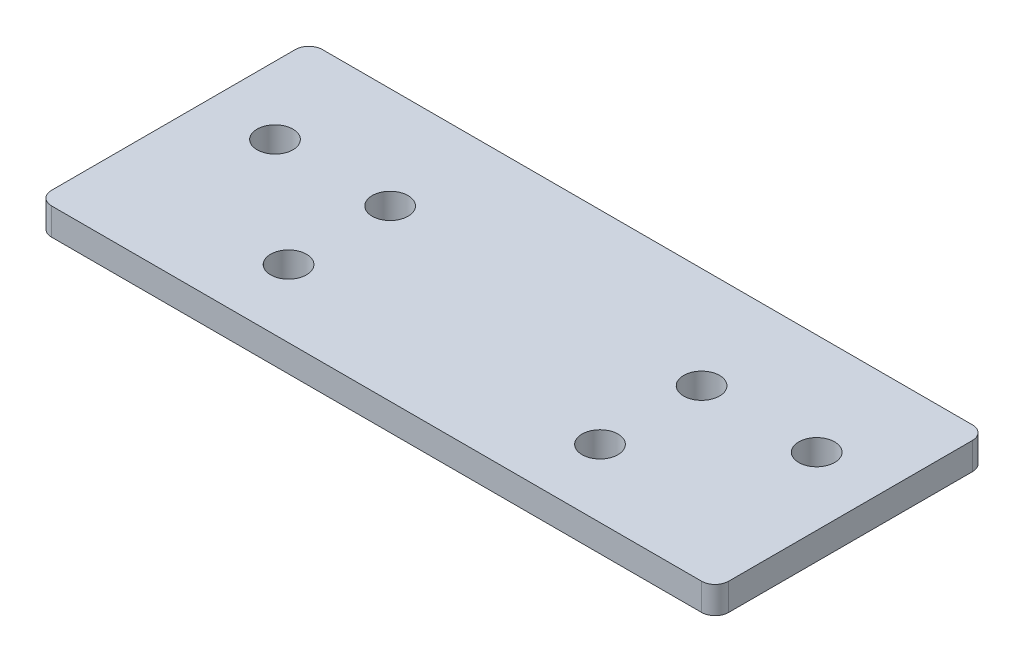
ISO-10303-21;
HEADER;
FILE_DESCRIPTION(('STEP AP214'),'2;1');
FILE_NAME('part.step','',(''),(''),'','','');
FILE_SCHEMA(('AUTOMOTIVE_DESIGN { 1 0 10303 214 1 1 1 1 }'));
ENDSEC;
DATA;
#1=APPLICATION_CONTEXT('core data for automotive mechanical design processes');
#2=APPLICATION_PROTOCOL_DEFINITION('international standard','automotive_design',2000,#1);
#3=PRODUCT_CONTEXT('',#1,'mechanical');
#4=PRODUCT('Part','Part','',(#3));
#5=PRODUCT_RELATED_PRODUCT_CATEGORY('part','',(#4));
#6=PRODUCT_DEFINITION_FORMATION('','',#4);
#7=PRODUCT_DEFINITION_CONTEXT('part definition',#1,'design');
#8=PRODUCT_DEFINITION('design','',#6,#7);
#9=PRODUCT_DEFINITION_SHAPE('','',#8);
#10=(LENGTH_UNIT() NAMED_UNIT(*) SI_UNIT(.MILLI.,.METRE.));
#11=(NAMED_UNIT(*) PLANE_ANGLE_UNIT() SI_UNIT($,.RADIAN.));
#12=(NAMED_UNIT(*) SI_UNIT($,.STERADIAN.) SOLID_ANGLE_UNIT());
#13=UNCERTAINTY_MEASURE_WITH_UNIT(LENGTH_MEASURE(1.E-05),#10,'distance_accuracy_value','');
#14=(GEOMETRIC_REPRESENTATION_CONTEXT(3) GLOBAL_UNCERTAINTY_ASSIGNED_CONTEXT((#13)) GLOBAL_UNIT_ASSIGNED_CONTEXT((#10,
#11,#12)) REPRESENTATION_CONTEXT('',''));
#15=CARTESIAN_POINT('',(0.,0.,0.));
#16=DIRECTION('',(0.,0.,1.));
#17=DIRECTION('',(1.,0.,0.));
#18=AXIS2_PLACEMENT_3D('',#15,#16,#17);
#19=CARTESIAN_POINT('',(-50.,4.,20.));
#20=DIRECTION('',(1.,0.,0.));
#21=DIRECTION('',(0.,0.,-1.));
#22=AXIS2_PLACEMENT_3D('',#19,#20,#21);
#23=PLANE('',#22);
#24=DIRECTION('',(0.,0.,1.));
#25=VECTOR('',#24,1.);
#26=CARTESIAN_POINT('',(-50.,4.,20.));
#27=LINE('',#26,#25);
#28=CARTESIAN_POINT('',(-50.,4.,-18.));
#29=VERTEX_POINT('',#28);
#30=CARTESIAN_POINT('',(-50.,4.,18.));
#31=VERTEX_POINT('',#30);
#32=EDGE_CURVE('E128',#29,#31,#27,.T.);
#33=ORIENTED_EDGE('',*,*,#32,.F.);
#34=DIRECTION('',(0.,-1.,0.));
#35=VECTOR('',#34,1.);
#36=CARTESIAN_POINT('',(-50.,4.,-18.));
#37=LINE('',#36,#35);
#38=CARTESIAN_POINT('',(-50.,0.,-18.));
#39=VERTEX_POINT('',#38);
#40=EDGE_CURVE('E11',#29,#39,#37,.T.);
#41=ORIENTED_EDGE('',*,*,#40,.T.);
#42=DIRECTION('',(0.,0.,1.));
#43=VECTOR('',#42,1.);
#44=CARTESIAN_POINT('',(-50.,0.,20.));
#45=LINE('',#44,#43);
#46=CARTESIAN_POINT('',(-50.,0.,18.));
#47=VERTEX_POINT('',#46);
#48=EDGE_CURVE('E130',#39,#47,#45,.T.);
#49=ORIENTED_EDGE('',*,*,#48,.T.);
#50=DIRECTION('',(0.,-1.,0.));
#51=VECTOR('',#50,1.);
#52=CARTESIAN_POINT('',(-50.,4.,18.));
#53=LINE('',#52,#51);
#54=EDGE_CURVE('E41',#47,#31,#53,.F.);
#55=ORIENTED_EDGE('',*,*,#54,.T.);
#56=EDGE_LOOP('',(#33,#41,#49,#55));
#57=FACE_BOUND('',#56,.T.);
#58=ADVANCED_FACE('F33',(#57),#23,.F.);
#59=CARTESIAN_POINT('',(50.,4.,20.));
#60=DIRECTION('',(0.,0.,-1.));
#61=DIRECTION('',(-1.,0.,0.));
#62=AXIS2_PLACEMENT_3D('',#59,#60,#61);
#63=PLANE('',#62);
#64=DIRECTION('',(1.,0.,0.));
#65=VECTOR('',#64,1.);
#66=CARTESIAN_POINT('',(50.,0.,20.));
#67=LINE('',#66,#65);
#68=CARTESIAN_POINT('',(-48.,0.,20.));
#69=VERTEX_POINT('',#68);
#70=CARTESIAN_POINT('',(48.,0.,20.));
#71=VERTEX_POINT('',#70);
#72=EDGE_CURVE('E126',#69,#71,#67,.T.);
#73=ORIENTED_EDGE('',*,*,#72,.T.);
#74=DIRECTION('',(0.,-1.,0.));
#75=VECTOR('',#74,1.);
#76=CARTESIAN_POINT('',(48.,4.,20.));
#77=LINE('',#76,#75);
#78=CARTESIAN_POINT('',(48.,4.,20.));
#79=VERTEX_POINT('',#78);
#80=EDGE_CURVE('E105',#71,#79,#77,.F.);
#81=ORIENTED_EDGE('',*,*,#80,.T.);
#82=DIRECTION('',(1.,0.,0.));
#83=VECTOR('',#82,1.);
#84=CARTESIAN_POINT('',(50.,4.,20.));
#85=LINE('',#84,#83);
#86=CARTESIAN_POINT('',(-48.,4.,20.));
#87=VERTEX_POINT('',#86);
#88=EDGE_CURVE('E166',#87,#79,#85,.T.);
#89=ORIENTED_EDGE('',*,*,#88,.F.);
#90=DIRECTION('',(0.,-1.,0.));
#91=VECTOR('',#90,1.);
#92=CARTESIAN_POINT('',(-48.,4.,20.));
#93=LINE('',#92,#91);
#94=EDGE_CURVE('E110',#87,#69,#93,.T.);
#95=ORIENTED_EDGE('',*,*,#94,.T.);
#96=EDGE_LOOP('',(#73,#81,#89,#95));
#97=FACE_BOUND('',#96,.T.);
#98=ADVANCED_FACE('F170',(#97),#63,.F.);
#99=CARTESIAN_POINT('',(50.,4.,20.));
#100=DIRECTION('',(-1.,0.,0.));
#101=DIRECTION('',(0.,0.,1.));
#102=AXIS2_PLACEMENT_3D('',#99,#100,#101);
#103=PLANE('',#102);
#104=DIRECTION('',(0.,0.,-1.));
#105=VECTOR('',#104,1.);
#106=CARTESIAN_POINT('',(50.,4.,20.));
#107=LINE('',#106,#105);
#108=CARTESIAN_POINT('',(50.,4.,18.));
#109=VERTEX_POINT('',#108);
#110=CARTESIAN_POINT('',(50.,4.,-18.));
#111=VERTEX_POINT('',#110);
#112=EDGE_CURVE('E119',#109,#111,#107,.T.);
#113=ORIENTED_EDGE('',*,*,#112,.F.);
#114=DIRECTION('',(0.,-1.,0.));
#115=VECTOR('',#114,1.);
#116=CARTESIAN_POINT('',(50.,4.,18.));
#117=LINE('',#116,#115);
#118=CARTESIAN_POINT('',(50.,0.,18.));
#119=VERTEX_POINT('',#118);
#120=EDGE_CURVE('E104',#109,#119,#117,.T.);
#121=ORIENTED_EDGE('',*,*,#120,.T.);
#122=DIRECTION('',(0.,0.,-1.));
#123=VECTOR('',#122,1.);
#124=CARTESIAN_POINT('',(50.,0.,20.));
#125=LINE('',#124,#123);
#126=CARTESIAN_POINT('',(50.,0.,-18.));
#127=VERTEX_POINT('',#126);
#128=EDGE_CURVE('E117',#119,#127,#125,.T.);
#129=ORIENTED_EDGE('',*,*,#128,.T.);
#130=DIRECTION('',(0.,-1.,0.));
#131=VECTOR('',#130,1.);
#132=CARTESIAN_POINT('',(50.,4.,-18.));
#133=LINE('',#132,#131);
#134=EDGE_CURVE('E121',#127,#111,#133,.F.);
#135=ORIENTED_EDGE('',*,*,#134,.T.);
#136=EDGE_LOOP('',(#113,#121,#129,#135));
#137=FACE_BOUND('',#136,.T.);
#138=ADVANCED_FACE('F116',(#137),#103,.F.);
#139=CARTESIAN_POINT('',(50.,4.,-20.));
#140=DIRECTION('',(0.,0.,1.));
#141=DIRECTION('',(1.,0.,0.));
#142=AXIS2_PLACEMENT_3D('',#139,#140,#141);
#143=PLANE('',#142);
#144=DIRECTION('',(-1.,0.,0.));
#145=VECTOR('',#144,1.);
#146=CARTESIAN_POINT('',(50.,4.,-20.));
#147=LINE('',#146,#145);
#148=CARTESIAN_POINT('',(48.,4.,-20.));
#149=VERTEX_POINT('',#148);
#150=CARTESIAN_POINT('',(-48.,4.,-20.));
#151=VERTEX_POINT('',#150);
#152=EDGE_CURVE('E134',#149,#151,#147,.T.);
#153=ORIENTED_EDGE('',*,*,#152,.F.);
#154=DIRECTION('',(0.,-1.,0.));
#155=VECTOR('',#154,1.);
#156=CARTESIAN_POINT('',(48.,4.,-20.));
#157=LINE('',#156,#155);
#158=CARTESIAN_POINT('',(48.,0.,-20.));
#159=VERTEX_POINT('',#158);
#160=EDGE_CURVE('E151',#149,#159,#157,.T.);
#161=ORIENTED_EDGE('',*,*,#160,.T.);
#162=DIRECTION('',(-1.,0.,0.));
#163=VECTOR('',#162,1.);
#164=CARTESIAN_POINT('',(50.,0.,-20.));
#165=LINE('',#164,#163);
#166=CARTESIAN_POINT('',(-48.,0.,-20.));
#167=VERTEX_POINT('',#166);
#168=EDGE_CURVE('E125',#159,#167,#165,.T.);
#169=ORIENTED_EDGE('',*,*,#168,.T.);
#170=DIRECTION('',(0.,-1.,0.));
#171=VECTOR('',#170,1.);
#172=CARTESIAN_POINT('',(-48.,4.,-20.));
#173=LINE('',#172,#171);
#174=EDGE_CURVE('E48',#167,#151,#173,.F.);
#175=ORIENTED_EDGE('',*,*,#174,.T.);
#176=EDGE_LOOP('',(#153,#161,#169,#175));
#177=FACE_BOUND('',#176,.T.);
#178=ADVANCED_FACE('F217',(#177),#143,.F.);
#179=CARTESIAN_POINT('',(0.,4.,0.));
#180=DIRECTION('',(0.,1.,0.));
#181=DIRECTION('',(0.,0.,1.));
#182=AXIS2_PLACEMENT_3D('',#179,#180,#181);
#183=PLANE('',#182);
#184=CARTESIAN_POINT('',(-40.,4.,-5.));
#185=DIRECTION('',(0.,1.,0.));
#186=DIRECTION('',(0.,0.,1.));
#187=AXIS2_PLACEMENT_3D('',#184,#185,#186);
#188=CIRCLE('',#187,2.64999999999999);
#189=CARTESIAN_POINT('',(-40.,4.,-2.35000000000001));
#190=VERTEX_POINT('',#189);
#191=EDGE_CURVE('E208',#190,#190,#188,.T.);
#192=ORIENTED_EDGE('',*,*,#191,.F.);
#193=EDGE_LOOP('',(#192));
#194=FACE_BOUND('',#193,.T.);
#195=CARTESIAN_POINT('',(-23.,4.,-5.));
#196=DIRECTION('',(0.,1.,0.));
#197=DIRECTION('',(0.,0.,1.));
#198=AXIS2_PLACEMENT_3D('',#195,#196,#197);
#199=CIRCLE('',#198,2.64999999999999);
#200=CARTESIAN_POINT('',(-23.,4.,-2.35000000000001));
#201=VERTEX_POINT('',#200);
#202=EDGE_CURVE('E202',#201,#201,#199,.T.);
#203=ORIENTED_EDGE('',*,*,#202,.F.);
#204=EDGE_LOOP('',(#203));
#205=FACE_BOUND('',#204,.T.);
#206=CARTESIAN_POINT('',(-23.,4.,10.));
#207=DIRECTION('',(0.,1.,0.));
#208=DIRECTION('',(0.,0.,1.));
#209=AXIS2_PLACEMENT_3D('',#206,#207,#208);
#210=CIRCLE('',#209,2.64999999999999);
#211=CARTESIAN_POINT('',(-23.,4.,12.65));
#212=VERTEX_POINT('',#211);
#213=EDGE_CURVE('E196',#212,#212,#210,.T.);
#214=ORIENTED_EDGE('',*,*,#213,.F.);
#215=EDGE_LOOP('',(#214));
#216=FACE_BOUND('',#215,.T.);
#217=CARTESIAN_POINT('',(23.,4.,9.99999999999999));
#218=DIRECTION('',(0.,1.,0.));
#219=DIRECTION('',(0.,0.,1.));
#220=AXIS2_PLACEMENT_3D('',#217,#218,#219);
#221=CIRCLE('',#220,2.64999999999999);
#222=CARTESIAN_POINT('',(23.,4.,12.65));
#223=VERTEX_POINT('',#222);
#224=EDGE_CURVE('E190',#223,#223,#221,.T.);
#225=ORIENTED_EDGE('',*,*,#224,.F.);
#226=EDGE_LOOP('',(#225));
#227=FACE_BOUND('',#226,.T.);
#228=CARTESIAN_POINT('',(23.,4.,-5.00000000000001));
#229=DIRECTION('',(0.,1.,0.));
#230=DIRECTION('',(0.,0.,1.));
#231=AXIS2_PLACEMENT_3D('',#228,#229,#230);
#232=CIRCLE('',#231,2.64999999999999);
#233=CARTESIAN_POINT('',(23.,4.,-2.35000000000002));
#234=VERTEX_POINT('',#233);
#235=EDGE_CURVE('E184',#234,#234,#232,.T.);
#236=ORIENTED_EDGE('',*,*,#235,.F.);
#237=EDGE_LOOP('',(#236));
#238=FACE_BOUND('',#237,.T.);
#239=CARTESIAN_POINT('',(40.,4.,-5.00000000000001));
#240=DIRECTION('',(0.,1.,0.));
#241=DIRECTION('',(0.,0.,1.));
#242=AXIS2_PLACEMENT_3D('',#239,#240,#241);
#243=CIRCLE('',#242,2.64999999999999);
#244=CARTESIAN_POINT('',(40.,4.,-2.35000000000002));
#245=VERTEX_POINT('',#244);
#246=EDGE_CURVE('E173',#245,#245,#243,.T.);
#247=ORIENTED_EDGE('',*,*,#246,.F.);
#248=EDGE_LOOP('',(#247));
#249=FACE_BOUND('',#248,.T.);
#250=ORIENTED_EDGE('',*,*,#88,.T.);
#251=CARTESIAN_POINT('',(48.,4.,18.));
#252=DIRECTION('',(0.,1.,0.));
#253=DIRECTION('',(0.,0.,1.));
#254=AXIS2_PLACEMENT_3D('',#251,#252,#253);
#255=CIRCLE('',#254,2.);
#256=EDGE_CURVE('E148',#79,#109,#255,.T.);
#257=ORIENTED_EDGE('',*,*,#256,.T.);
#258=ORIENTED_EDGE('',*,*,#112,.T.);
#259=CARTESIAN_POINT('',(48.,4.,-18.));
#260=DIRECTION('',(0.,1.,0.));
#261=DIRECTION('',(0.,0.,1.));
#262=AXIS2_PLACEMENT_3D('',#259,#260,#261);
#263=CIRCLE('',#262,2.);
#264=EDGE_CURVE('E55',#111,#149,#263,.T.);
#265=ORIENTED_EDGE('',*,*,#264,.T.);
#266=ORIENTED_EDGE('',*,*,#152,.T.);
#267=CARTESIAN_POINT('',(-48.,4.,-18.));
#268=DIRECTION('',(0.,1.,0.));
#269=DIRECTION('',(0.,0.,1.));
#270=AXIS2_PLACEMENT_3D('',#267,#268,#269);
#271=CIRCLE('',#270,2.);
#272=EDGE_CURVE('E145',#151,#29,#271,.T.);
#273=ORIENTED_EDGE('',*,*,#272,.T.);
#274=ORIENTED_EDGE('',*,*,#32,.T.);
#275=CARTESIAN_POINT('',(-48.,4.,18.));
#276=DIRECTION('',(0.,1.,0.));
#277=DIRECTION('',(0.,0.,1.));
#278=AXIS2_PLACEMENT_3D('',#275,#276,#277);
#279=CIRCLE('',#278,2.);
#280=EDGE_CURVE('E143',#31,#87,#279,.T.);
#281=ORIENTED_EDGE('',*,*,#280,.T.);
#282=EDGE_LOOP('',(#250,#257,#258,#265,#266,#273,#274,#281));
#283=FACE_BOUND('',#282,.T.);
#284=ADVANCED_FACE('F163',(#194,#205,#216,#227,#238,#249,#283),#183,.T.);
#285=CARTESIAN_POINT('',(0.,0.,0.));
#286=DIRECTION('',(0.,1.,0.));
#287=DIRECTION('',(0.,0.,1.));
#288=AXIS2_PLACEMENT_3D('',#285,#286,#287);
#289=PLANE('',#288);
#290=CARTESIAN_POINT('',(-40.,0.,-5.));
#291=DIRECTION('',(0.,1.,0.));
#292=DIRECTION('',(0.,0.,1.));
#293=AXIS2_PLACEMENT_3D('',#290,#291,#292);
#294=CIRCLE('',#293,2.64999999999999);
#295=CARTESIAN_POINT('',(-40.,0.,-2.35000000000001));
#296=VERTEX_POINT('',#295);
#297=EDGE_CURVE('E205',#296,#296,#294,.T.);
#298=ORIENTED_EDGE('',*,*,#297,.T.);
#299=EDGE_LOOP('',(#298));
#300=FACE_BOUND('',#299,.T.);
#301=CARTESIAN_POINT('',(-23.,0.,-5.));
#302=DIRECTION('',(0.,1.,0.));
#303=DIRECTION('',(0.,0.,1.));
#304=AXIS2_PLACEMENT_3D('',#301,#302,#303);
#305=CIRCLE('',#304,2.64999999999999);
#306=CARTESIAN_POINT('',(-23.,0.,-2.35000000000001));
#307=VERTEX_POINT('',#306);
#308=EDGE_CURVE('E199',#307,#307,#305,.T.);
#309=ORIENTED_EDGE('',*,*,#308,.T.);
#310=EDGE_LOOP('',(#309));
#311=FACE_BOUND('',#310,.T.);
#312=CARTESIAN_POINT('',(-23.,0.,10.));
#313=DIRECTION('',(0.,1.,0.));
#314=DIRECTION('',(0.,0.,1.));
#315=AXIS2_PLACEMENT_3D('',#312,#313,#314);
#316=CIRCLE('',#315,2.64999999999999);
#317=CARTESIAN_POINT('',(-23.,0.,12.65));
#318=VERTEX_POINT('',#317);
#319=EDGE_CURVE('E193',#318,#318,#316,.T.);
#320=ORIENTED_EDGE('',*,*,#319,.T.);
#321=EDGE_LOOP('',(#320));
#322=FACE_BOUND('',#321,.T.);
#323=CARTESIAN_POINT('',(23.,0.,9.99999999999999));
#324=DIRECTION('',(0.,1.,0.));
#325=DIRECTION('',(0.,0.,1.));
#326=AXIS2_PLACEMENT_3D('',#323,#324,#325);
#327=CIRCLE('',#326,2.64999999999999);
#328=CARTESIAN_POINT('',(23.,0.,12.65));
#329=VERTEX_POINT('',#328);
#330=EDGE_CURVE('E187',#329,#329,#327,.T.);
#331=ORIENTED_EDGE('',*,*,#330,.T.);
#332=EDGE_LOOP('',(#331));
#333=FACE_BOUND('',#332,.T.);
#334=CARTESIAN_POINT('',(23.,0.,-5.00000000000001));
#335=DIRECTION('',(0.,1.,0.));
#336=DIRECTION('',(0.,0.,1.));
#337=AXIS2_PLACEMENT_3D('',#334,#335,#336);
#338=CIRCLE('',#337,2.64999999999999);
#339=CARTESIAN_POINT('',(23.,0.,-2.35000000000002));
#340=VERTEX_POINT('',#339);
#341=EDGE_CURVE('E181',#340,#340,#338,.T.);
#342=ORIENTED_EDGE('',*,*,#341,.T.);
#343=EDGE_LOOP('',(#342));
#344=FACE_BOUND('',#343,.T.);
#345=CARTESIAN_POINT('',(40.,0.,-5.00000000000001));
#346=DIRECTION('',(0.,1.,0.));
#347=DIRECTION('',(0.,0.,1.));
#348=AXIS2_PLACEMENT_3D('',#345,#346,#347);
#349=CIRCLE('',#348,2.64999999999999);
#350=CARTESIAN_POINT('',(40.,0.,-2.35000000000002));
#351=VERTEX_POINT('',#350);
#352=EDGE_CURVE('E171',#351,#351,#349,.T.);
#353=ORIENTED_EDGE('',*,*,#352,.T.);
#354=EDGE_LOOP('',(#353));
#355=FACE_BOUND('',#354,.T.);
#356=ORIENTED_EDGE('',*,*,#128,.F.);
#357=CARTESIAN_POINT('',(48.,0.,18.));
#358=DIRECTION('',(0.,1.,0.));
#359=DIRECTION('',(0.,0.,1.));
#360=AXIS2_PLACEMENT_3D('',#357,#358,#359);
#361=CIRCLE('',#360,2.);
#362=EDGE_CURVE('E100',#119,#71,#361,.F.);
#363=ORIENTED_EDGE('',*,*,#362,.T.);
#364=ORIENTED_EDGE('',*,*,#72,.F.);
#365=CARTESIAN_POINT('',(-48.,0.,18.));
#366=DIRECTION('',(0.,1.,0.));
#367=DIRECTION('',(0.,0.,1.));
#368=AXIS2_PLACEMENT_3D('',#365,#366,#367);
#369=CIRCLE('',#368,2.);
#370=EDGE_CURVE('E120',#69,#47,#369,.F.);
#371=ORIENTED_EDGE('',*,*,#370,.T.);
#372=ORIENTED_EDGE('',*,*,#48,.F.);
#373=CARTESIAN_POINT('',(-48.,0.,-18.));
#374=DIRECTION('',(0.,1.,0.));
#375=DIRECTION('',(0.,0.,1.));
#376=AXIS2_PLACEMENT_3D('',#373,#374,#375);
#377=CIRCLE('',#376,2.);
#378=EDGE_CURVE('E137',#39,#167,#377,.F.);
#379=ORIENTED_EDGE('',*,*,#378,.T.);
#380=ORIENTED_EDGE('',*,*,#168,.F.);
#381=CARTESIAN_POINT('',(48.,0.,-18.));
#382=DIRECTION('',(0.,1.,0.));
#383=DIRECTION('',(0.,0.,1.));
#384=AXIS2_PLACEMENT_3D('',#381,#382,#383);
#385=CIRCLE('',#384,2.);
#386=EDGE_CURVE('E111',#159,#127,#385,.F.);
#387=ORIENTED_EDGE('',*,*,#386,.T.);
#388=EDGE_LOOP('',(#356,#363,#364,#371,#372,#379,#380,#387));
#389=FACE_BOUND('',#388,.T.);
#390=ADVANCED_FACE('F123',(#300,#311,#322,#333,#344,#355,#389),#289,.F.);
#391=CARTESIAN_POINT('',(48.,4.,18.));
#392=DIRECTION('',(0.,-1.,0.));
#393=DIRECTION('',(0.,0.,-1.));
#394=AXIS2_PLACEMENT_3D('',#391,#392,#393);
#395=CYLINDRICAL_SURFACE('',#394,2.);
#396=ORIENTED_EDGE('',*,*,#256,.F.);
#397=ORIENTED_EDGE('',*,*,#80,.F.);
#398=ORIENTED_EDGE('',*,*,#362,.F.);
#399=ORIENTED_EDGE('',*,*,#120,.F.);
#400=EDGE_LOOP('',(#396,#397,#398,#399));
#401=FACE_BOUND('',#400,.T.);
#402=ADVANCED_FACE('F103',(#401),#395,.T.);
#403=CARTESIAN_POINT('',(48.,4.,-18.));
#404=DIRECTION('',(0.,-1.,0.));
#405=DIRECTION('',(0.,0.,-1.));
#406=AXIS2_PLACEMENT_3D('',#403,#404,#405);
#407=CYLINDRICAL_SURFACE('',#406,2.);
#408=ORIENTED_EDGE('',*,*,#264,.F.);
#409=ORIENTED_EDGE('',*,*,#134,.F.);
#410=ORIENTED_EDGE('',*,*,#386,.F.);
#411=ORIENTED_EDGE('',*,*,#160,.F.);
#412=EDGE_LOOP('',(#408,#409,#410,#411));
#413=FACE_BOUND('',#412,.T.);
#414=ADVANCED_FACE('F242',(#413),#407,.T.);
#415=CARTESIAN_POINT('',(-48.,4.,-18.));
#416=DIRECTION('',(0.,-1.,0.));
#417=DIRECTION('',(0.,0.,-1.));
#418=AXIS2_PLACEMENT_3D('',#415,#416,#417);
#419=CYLINDRICAL_SURFACE('',#418,2.);
#420=ORIENTED_EDGE('',*,*,#272,.F.);
#421=ORIENTED_EDGE('',*,*,#174,.F.);
#422=ORIENTED_EDGE('',*,*,#378,.F.);
#423=ORIENTED_EDGE('',*,*,#40,.F.);
#424=EDGE_LOOP('',(#420,#421,#422,#423));
#425=FACE_BOUND('',#424,.T.);
#426=ADVANCED_FACE('F255',(#425),#419,.T.);
#427=CARTESIAN_POINT('',(-48.,4.,18.));
#428=DIRECTION('',(0.,-1.,0.));
#429=DIRECTION('',(0.,0.,-1.));
#430=AXIS2_PLACEMENT_3D('',#427,#428,#429);
#431=CYLINDRICAL_SURFACE('',#430,2.);
#432=ORIENTED_EDGE('',*,*,#280,.F.);
#433=ORIENTED_EDGE('',*,*,#54,.F.);
#434=ORIENTED_EDGE('',*,*,#370,.F.);
#435=ORIENTED_EDGE('',*,*,#94,.F.);
#436=EDGE_LOOP('',(#432,#433,#434,#435));
#437=FACE_BOUND('',#436,.T.);
#438=ADVANCED_FACE('F35',(#437),#431,.T.);
#439=CARTESIAN_POINT('',(40.,4.,-5.00000000000001));
#440=DIRECTION('',(0.,1.,0.));
#441=DIRECTION('',(0.,0.,1.));
#442=AXIS2_PLACEMENT_3D('',#439,#440,#441);
#443=CYLINDRICAL_SURFACE('',#442,2.64999999999999);
#444=ORIENTED_EDGE('',*,*,#246,.T.);
#445=EDGE_LOOP('',(#444));
#446=FACE_BOUND('',#445,.T.);
#447=ORIENTED_EDGE('',*,*,#352,.F.);
#448=EDGE_LOOP('',(#447));
#449=FACE_BOUND('',#448,.T.);
#450=ADVANCED_FACE('F229',(#446,#449),#443,.F.);
#451=CARTESIAN_POINT('',(23.,4.,-5.00000000000001));
#452=DIRECTION('',(0.,1.,0.));
#453=DIRECTION('',(0.,0.,1.));
#454=AXIS2_PLACEMENT_3D('',#451,#452,#453);
#455=CYLINDRICAL_SURFACE('',#454,2.64999999999999);
#456=ORIENTED_EDGE('',*,*,#235,.T.);
#457=EDGE_LOOP('',(#456));
#458=FACE_BOUND('',#457,.T.);
#459=ORIENTED_EDGE('',*,*,#341,.F.);
#460=EDGE_LOOP('',(#459));
#461=FACE_BOUND('',#460,.T.);
#462=ADVANCED_FACE('F232',(#458,#461),#455,.F.);
#463=CARTESIAN_POINT('',(23.,4.,9.99999999999999));
#464=DIRECTION('',(0.,1.,0.));
#465=DIRECTION('',(0.,0.,1.));
#466=AXIS2_PLACEMENT_3D('',#463,#464,#465);
#467=CYLINDRICAL_SURFACE('',#466,2.64999999999999);
#468=ORIENTED_EDGE('',*,*,#224,.T.);
#469=EDGE_LOOP('',(#468));
#470=FACE_BOUND('',#469,.T.);
#471=ORIENTED_EDGE('',*,*,#330,.F.);
#472=EDGE_LOOP('',(#471));
#473=FACE_BOUND('',#472,.T.);
#474=ADVANCED_FACE('F275',(#470,#473),#467,.F.);
#475=CARTESIAN_POINT('',(-23.,4.,10.));
#476=DIRECTION('',(0.,1.,0.));
#477=DIRECTION('',(0.,0.,1.));
#478=AXIS2_PLACEMENT_3D('',#475,#476,#477);
#479=CYLINDRICAL_SURFACE('',#478,2.64999999999999);
#480=ORIENTED_EDGE('',*,*,#213,.T.);
#481=EDGE_LOOP('',(#480));
#482=FACE_BOUND('',#481,.T.);
#483=ORIENTED_EDGE('',*,*,#319,.F.);
#484=EDGE_LOOP('',(#483));
#485=FACE_BOUND('',#484,.T.);
#486=ADVANCED_FACE('F283',(#482,#485),#479,.F.);
#487=CARTESIAN_POINT('',(-23.,4.,-5.));
#488=DIRECTION('',(0.,1.,0.));
#489=DIRECTION('',(0.,0.,1.));
#490=AXIS2_PLACEMENT_3D('',#487,#488,#489);
#491=CYLINDRICAL_SURFACE('',#490,2.64999999999999);
#492=ORIENTED_EDGE('',*,*,#202,.T.);
#493=EDGE_LOOP('',(#492));
#494=FACE_BOUND('',#493,.T.);
#495=ORIENTED_EDGE('',*,*,#308,.F.);
#496=EDGE_LOOP('',(#495));
#497=FACE_BOUND('',#496,.T.);
#498=ADVANCED_FACE('F291',(#494,#497),#491,.F.);
#499=CARTESIAN_POINT('',(-40.,4.,-5.));
#500=DIRECTION('',(0.,1.,0.));
#501=DIRECTION('',(0.,0.,1.));
#502=AXIS2_PLACEMENT_3D('',#499,#500,#501);
#503=CYLINDRICAL_SURFACE('',#502,2.64999999999999);
#504=ORIENTED_EDGE('',*,*,#191,.T.);
#505=EDGE_LOOP('',(#504));
#506=FACE_BOUND('',#505,.T.);
#507=ORIENTED_EDGE('',*,*,#297,.F.);
#508=EDGE_LOOP('',(#507));
#509=FACE_BOUND('',#508,.T.);
#510=ADVANCED_FACE('F212',(#506,#509),#503,.F.);
#511=CLOSED_SHELL('',(#58,#98,#138,#178,#284,#390,#402,#414,#426,#438,#450,#462,#474,#486,#498,#510));
#512=MANIFOLD_SOLID_BREP('B2',#511);
#513=ADVANCED_BREP_SHAPE_REPRESENTATION('',(#18,#512),#14);
#514=SHAPE_DEFINITION_REPRESENTATION(#9,#513);
ENDSEC;
END-ISO-10303-21;
